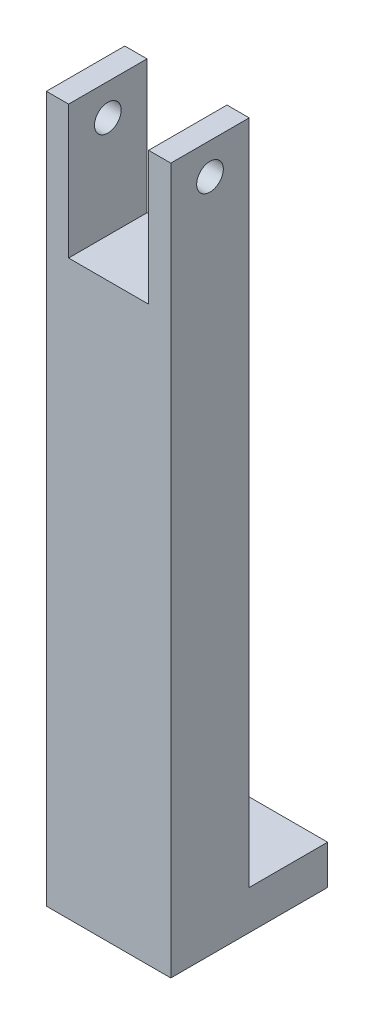
ISO-10303-21;
HEADER;
FILE_DESCRIPTION(('STEP AP214'),'2;1');
FILE_NAME('part.step','',(''),(''),'','','');
FILE_SCHEMA(('AUTOMOTIVE_DESIGN { 1 0 10303 214 1 1 1 1 }'));
ENDSEC;
DATA;
#1=APPLICATION_CONTEXT('core data for automotive mechanical design processes');
#2=APPLICATION_PROTOCOL_DEFINITION('international standard','automotive_design',2000,#1);
#3=PRODUCT_CONTEXT('',#1,'mechanical');
#4=PRODUCT('Part','Part','',(#3));
#5=PRODUCT_RELATED_PRODUCT_CATEGORY('part','',(#4));
#6=PRODUCT_DEFINITION_FORMATION('','',#4);
#7=PRODUCT_DEFINITION_CONTEXT('part definition',#1,'design');
#8=PRODUCT_DEFINITION('design','',#6,#7);
#9=PRODUCT_DEFINITION_SHAPE('','',#8);
#10=(LENGTH_UNIT() NAMED_UNIT(*) SI_UNIT(.MILLI.,.METRE.));
#11=(NAMED_UNIT(*) PLANE_ANGLE_UNIT() SI_UNIT($,.RADIAN.));
#12=(NAMED_UNIT(*) SI_UNIT($,.STERADIAN.) SOLID_ANGLE_UNIT());
#13=UNCERTAINTY_MEASURE_WITH_UNIT(LENGTH_MEASURE(1.E-05),#10,'distance_accuracy_value','');
#14=(GEOMETRIC_REPRESENTATION_CONTEXT(3) GLOBAL_UNCERTAINTY_ASSIGNED_CONTEXT((#13)) GLOBAL_UNIT_ASSIGNED_CONTEXT((#10,
#11,#12)) REPRESENTATION_CONTEXT('',''));
#15=CARTESIAN_POINT('',(0.,0.,0.));
#16=DIRECTION('',(0.,0.,1.));
#17=DIRECTION('',(1.,0.,0.));
#18=AXIS2_PLACEMENT_3D('',#15,#16,#17);
#19=CARTESIAN_POINT('',(15.8666666666667,85.,10.));
#20=DIRECTION('',(-1.,0.,0.));
#21=DIRECTION('',(0.,0.,1.));
#22=AXIS2_PLACEMENT_3D('',#19,#20,#21);
#23=PLANE('',#22);
#24=CARTESIAN_POINT('',(15.8666666666667,81.,5.));
#25=DIRECTION('',(1.,0.,0.));
#26=DIRECTION('',(0.,0.,-1.));
#27=AXIS2_PLACEMENT_3D('',#24,#25,#26);
#28=CIRCLE('',#27,1.69999999999999);
#29=CARTESIAN_POINT('',(15.8666666666667,81.,3.30000000000001));
#30=VERTEX_POINT('',#29);
#31=EDGE_CURVE('E154',#30,#30,#28,.T.);
#32=ORIENTED_EDGE('',*,*,#31,.F.);
#33=EDGE_LOOP('',(#32));
#34=FACE_BOUND('',#33,.T.);
#35=DIRECTION('',(0.,1.,0.));
#36=VECTOR('',#35,1.);
#37=CARTESIAN_POINT('',(15.8666666666667,85.,0.));
#38=LINE('',#37,#36);
#39=CARTESIAN_POINT('',(15.8666666666667,0.,0.));
#40=VERTEX_POINT('',#39);
#41=CARTESIAN_POINT('',(15.8666666666667,85.,0.));
#42=VERTEX_POINT('',#41);
#43=EDGE_CURVE('E134',#40,#42,#38,.T.);
#44=ORIENTED_EDGE('',*,*,#43,.T.);
#45=DIRECTION('',(0.,0.,-1.));
#46=VECTOR('',#45,1.);
#47=CARTESIAN_POINT('',(15.8666666666667,85.,10.));
#48=LINE('',#47,#46);
#49=CARTESIAN_POINT('',(15.8666666666667,85.,10.));
#50=VERTEX_POINT('',#49);
#51=EDGE_CURVE('E11',#50,#42,#48,.T.);
#52=ORIENTED_EDGE('',*,*,#51,.F.);
#53=DIRECTION('',(0.,1.,0.));
#54=VECTOR('',#53,1.);
#55=CARTESIAN_POINT('',(15.8666666666667,79.3333333333334,10.));
#56=LINE('',#55,#54);
#57=CARTESIAN_POINT('',(15.8666666666667,-5.,10.));
#58=VERTEX_POINT('',#57);
#59=EDGE_CURVE('E90',#58,#50,#56,.T.);
#60=ORIENTED_EDGE('',*,*,#59,.F.);
#61=DIRECTION('',(0.,0.,-1.));
#62=VECTOR('',#61,1.);
#63=CARTESIAN_POINT('',(15.8666666666667,-5.,26.6358381547523));
#64=LINE('',#63,#62);
#65=CARTESIAN_POINT('',(15.8666666666667,-5.,-10.));
#66=VERTEX_POINT('',#65);
#67=EDGE_CURVE('E189',#58,#66,#64,.T.);
#68=ORIENTED_EDGE('',*,*,#67,.T.);
#69=DIRECTION('',(0.,-1.,0.));
#70=VECTOR('',#69,1.);
#71=CARTESIAN_POINT('',(15.8666666666667,0.,-10.));
#72=LINE('',#71,#70);
#73=CARTESIAN_POINT('',(15.8666666666667,0.,-10.));
#74=VERTEX_POINT('',#73);
#75=EDGE_CURVE('E173',#74,#66,#72,.T.);
#76=ORIENTED_EDGE('',*,*,#75,.F.);
#77=DIRECTION('',(0.,0.,-1.));
#78=VECTOR('',#77,1.);
#79=CARTESIAN_POINT('',(15.8666666666667,0.,26.6358381547523));
#80=LINE('',#79,#78);
#81=EDGE_CURVE('E182',#40,#74,#80,.T.);
#82=ORIENTED_EDGE('',*,*,#81,.F.);
#83=EDGE_LOOP('',(#44,#52,#60,#68,#76,#82));
#84=FACE_BOUND('',#83,.T.);
#85=ADVANCED_FACE('F33',(#34,#84),#23,.F.);
#86=CARTESIAN_POINT('',(13.0333333333333,85.,10.));
#87=DIRECTION('',(0.,-1.,0.));
#88=DIRECTION('',(0.,0.,-1.));
#89=AXIS2_PLACEMENT_3D('',#86,#87,#88);
#90=PLANE('',#89);
#91=DIRECTION('',(-1.,0.,0.));
#92=VECTOR('',#91,1.);
#93=CARTESIAN_POINT('',(13.0333333333333,85.,0.));
#94=LINE('',#93,#92);
#95=CARTESIAN_POINT('',(13.0333333333333,85.,0.));
#96=VERTEX_POINT('',#95);
#97=EDGE_CURVE('E137',#42,#96,#94,.T.);
#98=ORIENTED_EDGE('',*,*,#97,.T.);
#99=DIRECTION('',(0.,0.,-1.));
#100=VECTOR('',#99,1.);
#101=CARTESIAN_POINT('',(13.0333333333333,85.,10.));
#102=LINE('',#101,#100);
#103=CARTESIAN_POINT('',(13.0333333333333,85.,10.));
#104=VERTEX_POINT('',#103);
#105=EDGE_CURVE('E42',#104,#96,#102,.T.);
#106=ORIENTED_EDGE('',*,*,#105,.F.);
#107=DIRECTION('',(-1.,0.,0.));
#108=VECTOR('',#107,1.);
#109=CARTESIAN_POINT('',(13.0333333333333,85.,10.));
#110=LINE('',#109,#108);
#111=EDGE_CURVE('E195',#50,#104,#110,.T.);
#112=ORIENTED_EDGE('',*,*,#111,.F.);
#113=ORIENTED_EDGE('',*,*,#51,.T.);
#114=EDGE_LOOP('',(#98,#106,#112,#113));
#115=FACE_BOUND('',#114,.T.);
#116=ADVANCED_FACE('F199',(#115),#90,.F.);
#117=CARTESIAN_POINT('',(13.0333333333333,68.,10.));
#118=DIRECTION('',(1.,0.,0.));
#119=DIRECTION('',(0.,0.,-1.));
#120=AXIS2_PLACEMENT_3D('',#117,#118,#119);
#121=PLANE('',#120);
#122=CARTESIAN_POINT('',(13.0333333333333,81.,5.));
#123=DIRECTION('',(1.,0.,0.));
#124=DIRECTION('',(0.,0.,-1.));
#125=AXIS2_PLACEMENT_3D('',#122,#123,#124);
#126=CIRCLE('',#125,1.69999999999999);
#127=CARTESIAN_POINT('',(13.0333333333333,81.,3.30000000000001));
#128=VERTEX_POINT('',#127);
#129=EDGE_CURVE('E158',#128,#128,#126,.T.);
#130=ORIENTED_EDGE('',*,*,#129,.T.);
#131=EDGE_LOOP('',(#130));
#132=FACE_BOUND('',#131,.T.);
#133=DIRECTION('',(0.,-1.,0.));
#134=VECTOR('',#133,1.);
#135=CARTESIAN_POINT('',(13.0333333333333,68.,0.));
#136=LINE('',#135,#134);
#137=CARTESIAN_POINT('',(13.0333333333333,68.,0.));
#138=VERTEX_POINT('',#137);
#139=EDGE_CURVE('E139',#96,#138,#136,.T.);
#140=ORIENTED_EDGE('',*,*,#139,.T.);
#141=DIRECTION('',(0.,0.,-1.));
#142=VECTOR('',#141,1.);
#143=CARTESIAN_POINT('',(13.0333333333333,68.,10.));
#144=LINE('',#143,#142);
#145=CARTESIAN_POINT('',(13.0333333333333,68.,10.));
#146=VERTEX_POINT('',#145);
#147=EDGE_CURVE('E119',#146,#138,#144,.T.);
#148=ORIENTED_EDGE('',*,*,#147,.F.);
#149=DIRECTION('',(0.,-1.,0.));
#150=VECTOR('',#149,1.);
#151=CARTESIAN_POINT('',(13.0333333333333,68.,10.));
#152=LINE('',#151,#150);
#153=EDGE_CURVE('E107',#104,#146,#152,.T.);
#154=ORIENTED_EDGE('',*,*,#153,.F.);
#155=ORIENTED_EDGE('',*,*,#105,.T.);
#156=EDGE_LOOP('',(#140,#148,#154,#155));
#157=FACE_BOUND('',#156,.T.);
#158=ADVANCED_FACE('F203',(#132,#157),#121,.F.);
#159=CARTESIAN_POINT('',(2.83333333333333,68.,10.));
#160=DIRECTION('',(0.,-1.,0.));
#161=DIRECTION('',(0.,0.,-1.));
#162=AXIS2_PLACEMENT_3D('',#159,#160,#161);
#163=PLANE('',#162);
#164=DIRECTION('',(-1.,0.,0.));
#165=VECTOR('',#164,1.);
#166=CARTESIAN_POINT('',(2.83333333333333,68.,0.));
#167=LINE('',#166,#165);
#168=CARTESIAN_POINT('',(2.83333333333333,68.,0.));
#169=VERTEX_POINT('',#168);
#170=EDGE_CURVE('E116',#138,#169,#167,.T.);
#171=ORIENTED_EDGE('',*,*,#170,.T.);
#172=DIRECTION('',(0.,0.,-1.));
#173=VECTOR('',#172,1.);
#174=CARTESIAN_POINT('',(2.83333333333333,68.,10.));
#175=LINE('',#174,#173);
#176=CARTESIAN_POINT('',(2.83333333333333,68.,10.));
#177=VERTEX_POINT('',#176);
#178=EDGE_CURVE('E113',#177,#169,#175,.T.);
#179=ORIENTED_EDGE('',*,*,#178,.F.);
#180=DIRECTION('',(-1.,0.,0.));
#181=VECTOR('',#180,1.);
#182=CARTESIAN_POINT('',(2.83333333333333,68.,10.));
#183=LINE('',#182,#181);
#184=EDGE_CURVE('E100',#146,#177,#183,.T.);
#185=ORIENTED_EDGE('',*,*,#184,.F.);
#186=ORIENTED_EDGE('',*,*,#147,.T.);
#187=EDGE_LOOP('',(#171,#179,#185,#186));
#188=FACE_BOUND('',#187,.T.);
#189=ADVANCED_FACE('F114',(#188),#163,.F.);
#190=CARTESIAN_POINT('',(2.83333333333333,85.,10.));
#191=DIRECTION('',(-1.,0.,0.));
#192=DIRECTION('',(0.,0.,1.));
#193=AXIS2_PLACEMENT_3D('',#190,#191,#192);
#194=PLANE('',#193);
#195=CARTESIAN_POINT('',(2.83333333333333,81.,5.));
#196=DIRECTION('',(-1.,0.,0.));
#197=DIRECTION('',(0.,0.,1.));
#198=AXIS2_PLACEMENT_3D('',#195,#196,#197);
#199=CIRCLE('',#198,1.69999999999999);
#200=CARTESIAN_POINT('',(2.83333333333333,81.,6.69999999999999));
#201=VERTEX_POINT('',#200);
#202=EDGE_CURVE('E153',#201,#201,#199,.T.);
#203=ORIENTED_EDGE('',*,*,#202,.T.);
#204=EDGE_LOOP('',(#203));
#205=FACE_BOUND('',#204,.T.);
#206=DIRECTION('',(0.,1.,0.));
#207=VECTOR('',#206,1.);
#208=CARTESIAN_POINT('',(2.83333333333333,85.,0.));
#209=LINE('',#208,#207);
#210=CARTESIAN_POINT('',(2.83333333333333,85.,0.));
#211=VERTEX_POINT('',#210);
#212=EDGE_CURVE('E142',#169,#211,#209,.T.);
#213=ORIENTED_EDGE('',*,*,#212,.T.);
#214=DIRECTION('',(0.,0.,-1.));
#215=VECTOR('',#214,1.);
#216=CARTESIAN_POINT('',(2.83333333333333,85.,10.));
#217=LINE('',#216,#215);
#218=CARTESIAN_POINT('',(2.83333333333333,85.,10.));
#219=VERTEX_POINT('',#218);
#220=EDGE_CURVE('E120',#219,#211,#217,.T.);
#221=ORIENTED_EDGE('',*,*,#220,.F.);
#222=DIRECTION('',(0.,1.,0.));
#223=VECTOR('',#222,1.);
#224=CARTESIAN_POINT('',(2.83333333333333,85.,10.));
#225=LINE('',#224,#223);
#226=EDGE_CURVE('E104',#177,#219,#225,.T.);
#227=ORIENTED_EDGE('',*,*,#226,.F.);
#228=ORIENTED_EDGE('',*,*,#178,.T.);
#229=EDGE_LOOP('',(#213,#221,#227,#228));
#230=FACE_BOUND('',#229,.T.);
#231=ADVANCED_FACE('F122',(#205,#230),#194,.F.);
#232=CARTESIAN_POINT('',(0.,85.,10.));
#233=DIRECTION('',(0.,-1.,0.));
#234=DIRECTION('',(0.,0.,-1.));
#235=AXIS2_PLACEMENT_3D('',#232,#233,#234);
#236=PLANE('',#235);
#237=DIRECTION('',(-1.,0.,0.));
#238=VECTOR('',#237,1.);
#239=CARTESIAN_POINT('',(0.,85.,0.));
#240=LINE('',#239,#238);
#241=CARTESIAN_POINT('',(0.,85.,0.));
#242=VERTEX_POINT('',#241);
#243=EDGE_CURVE('E144',#211,#242,#240,.T.);
#244=ORIENTED_EDGE('',*,*,#243,.T.);
#245=DIRECTION('',(0.,0.,-1.));
#246=VECTOR('',#245,1.);
#247=CARTESIAN_POINT('',(0.,85.,10.));
#248=LINE('',#247,#246);
#249=CARTESIAN_POINT('',(0.,85.,10.));
#250=VERTEX_POINT('',#249);
#251=EDGE_CURVE('E130',#250,#242,#248,.T.);
#252=ORIENTED_EDGE('',*,*,#251,.F.);
#253=DIRECTION('',(-1.,0.,0.));
#254=VECTOR('',#253,1.);
#255=CARTESIAN_POINT('',(0.,85.,10.));
#256=LINE('',#255,#254);
#257=EDGE_CURVE('E51',#219,#250,#256,.T.);
#258=ORIENTED_EDGE('',*,*,#257,.F.);
#259=ORIENTED_EDGE('',*,*,#220,.T.);
#260=EDGE_LOOP('',(#244,#252,#258,#259));
#261=FACE_BOUND('',#260,.T.);
#262=ADVANCED_FACE('F206',(#261),#236,.F.);
#263=CARTESIAN_POINT('',(0.,0.,10.));
#264=DIRECTION('',(1.,0.,0.));
#265=DIRECTION('',(0.,0.,-1.));
#266=AXIS2_PLACEMENT_3D('',#263,#264,#265);
#267=PLANE('',#266);
#268=CARTESIAN_POINT('',(0.,81.,5.));
#269=DIRECTION('',(1.,0.,0.));
#270=DIRECTION('',(0.,0.,-1.));
#271=AXIS2_PLACEMENT_3D('',#268,#269,#270);
#272=CIRCLE('',#271,1.69999999999999);
#273=CARTESIAN_POINT('',(0.,81.,3.30000000000001));
#274=VERTEX_POINT('',#273);
#275=EDGE_CURVE('E151',#274,#274,#272,.T.);
#276=ORIENTED_EDGE('',*,*,#275,.T.);
#277=EDGE_LOOP('',(#276));
#278=FACE_BOUND('',#277,.T.);
#279=DIRECTION('',(0.,-1.,0.));
#280=VECTOR('',#279,1.);
#281=CARTESIAN_POINT('',(0.,0.,0.));
#282=LINE('',#281,#280);
#283=CARTESIAN_POINT('',(0.,0.,0.));
#284=VERTEX_POINT('',#283);
#285=EDGE_CURVE('E78',#242,#284,#282,.T.);
#286=ORIENTED_EDGE('',*,*,#285,.T.);
#287=DIRECTION('',(0.,0.,-1.));
#288=VECTOR('',#287,1.);
#289=CARTESIAN_POINT('',(0.,0.,26.6358381547523));
#290=LINE('',#289,#288);
#291=CARTESIAN_POINT('',(0.,0.,-10.));
#292=VERTEX_POINT('',#291);
#293=EDGE_CURVE('E184',#284,#292,#290,.T.);
#294=ORIENTED_EDGE('',*,*,#293,.T.);
#295=DIRECTION('',(0.,1.,0.));
#296=VECTOR('',#295,1.);
#297=CARTESIAN_POINT('',(0.,-5.,-10.));
#298=LINE('',#297,#296);
#299=CARTESIAN_POINT('',(0.,-5.,-10.));
#300=VERTEX_POINT('',#299);
#301=EDGE_CURVE('E179',#300,#292,#298,.T.);
#302=ORIENTED_EDGE('',*,*,#301,.F.);
#303=DIRECTION('',(0.,0.,-1.));
#304=VECTOR('',#303,1.);
#305=CARTESIAN_POINT('',(0.,-5.,26.6358381547523));
#306=LINE('',#305,#304);
#307=CARTESIAN_POINT('',(0.,-5.,10.));
#308=VERTEX_POINT('',#307);
#309=EDGE_CURVE('E186',#308,#300,#306,.T.);
#310=ORIENTED_EDGE('',*,*,#309,.F.);
#311=DIRECTION('',(0.,-1.,0.));
#312=VECTOR('',#311,1.);
#313=CARTESIAN_POINT('',(0.,79.3333333333334,10.));
#314=LINE('',#313,#312);
#315=EDGE_CURVE('E125',#250,#308,#314,.T.);
#316=ORIENTED_EDGE('',*,*,#315,.F.);
#317=ORIENTED_EDGE('',*,*,#251,.T.);
#318=EDGE_LOOP('',(#286,#294,#302,#310,#316,#317));
#319=FACE_BOUND('',#318,.T.);
#320=ADVANCED_FACE('F209',(#278,#319),#267,.F.);
#321=CARTESIAN_POINT('',(0.,0.,10.));
#322=DIRECTION('',(0.,0.,-1.));
#323=DIRECTION('',(-1.,0.,0.));
#324=AXIS2_PLACEMENT_3D('',#321,#322,#323);
#325=PLANE('',#324);
#326=ORIENTED_EDGE('',*,*,#315,.T.);
#327=DIRECTION('',(1.,0.,0.));
#328=VECTOR('',#327,1.);
#329=CARTESIAN_POINT('',(15.8666666666667,-5.,10.));
#330=LINE('',#329,#328);
#331=EDGE_CURVE('E135',#308,#58,#330,.T.);
#332=ORIENTED_EDGE('',*,*,#331,.T.);
#333=ORIENTED_EDGE('',*,*,#59,.T.);
#334=ORIENTED_EDGE('',*,*,#111,.T.);
#335=ORIENTED_EDGE('',*,*,#153,.T.);
#336=ORIENTED_EDGE('',*,*,#184,.T.);
#337=ORIENTED_EDGE('',*,*,#226,.T.);
#338=ORIENTED_EDGE('',*,*,#257,.T.);
#339=EDGE_LOOP('',(#326,#332,#333,#334,#335,#336,#337,#338));
#340=FACE_BOUND('',#339,.T.);
#341=ADVANCED_FACE('F102',(#340),#325,.F.);
#342=CARTESIAN_POINT('',(0.,0.,0.));
#343=DIRECTION('',(0.,0.,-1.));
#344=DIRECTION('',(-1.,0.,0.));
#345=AXIS2_PLACEMENT_3D('',#342,#343,#344);
#346=PLANE('',#345);
#347=DIRECTION('',(1.,0.,0.));
#348=VECTOR('',#347,1.);
#349=CARTESIAN_POINT('',(0.,0.,0.));
#350=LINE('',#349,#348);
#351=EDGE_CURVE('E131',#284,#40,#350,.T.);
#352=ORIENTED_EDGE('',*,*,#351,.F.);
#353=ORIENTED_EDGE('',*,*,#285,.F.);
#354=ORIENTED_EDGE('',*,*,#243,.F.);
#355=ORIENTED_EDGE('',*,*,#212,.F.);
#356=ORIENTED_EDGE('',*,*,#170,.F.);
#357=ORIENTED_EDGE('',*,*,#139,.F.);
#358=ORIENTED_EDGE('',*,*,#97,.F.);
#359=ORIENTED_EDGE('',*,*,#43,.F.);
#360=EDGE_LOOP('',(#352,#353,#354,#355,#356,#357,#358,#359));
#361=FACE_BOUND('',#360,.T.);
#362=ADVANCED_FACE('F204',(#361),#346,.T.);
#363=CARTESIAN_POINT('',(0.,0.,26.6358381547523));
#364=DIRECTION('',(0.,1.,0.));
#365=DIRECTION('',(0.,0.,1.));
#366=AXIS2_PLACEMENT_3D('',#363,#364,#365);
#367=PLANE('',#366);
#368=CARTESIAN_POINT('',(7.93333333333333,0.,-5.));
#369=DIRECTION('',(0.,1.,0.));
#370=DIRECTION('',(0.,0.,1.));
#371=AXIS2_PLACEMENT_3D('',#368,#369,#370);
#372=CIRCLE('',#371,1.7);
#373=CARTESIAN_POINT('',(7.93333333333333,0.,-3.3));
#374=VERTEX_POINT('',#373);
#375=EDGE_CURVE('E165',#374,#374,#372,.T.);
#376=ORIENTED_EDGE('',*,*,#375,.F.);
#377=EDGE_LOOP('',(#376));
#378=FACE_BOUND('',#377,.T.);
#379=ORIENTED_EDGE('',*,*,#293,.F.);
#380=ORIENTED_EDGE('',*,*,#351,.T.);
#381=ORIENTED_EDGE('',*,*,#81,.T.);
#382=DIRECTION('',(1.,0.,0.));
#383=VECTOR('',#382,1.);
#384=CARTESIAN_POINT('',(0.,0.,-10.));
#385=LINE('',#384,#383);
#386=EDGE_CURVE('E170',#292,#74,#385,.T.);
#387=ORIENTED_EDGE('',*,*,#386,.F.);
#388=EDGE_LOOP('',(#379,#380,#381,#387));
#389=FACE_BOUND('',#388,.T.);
#390=ADVANCED_FACE('F233',(#378,#389),#367,.T.);
#391=CARTESIAN_POINT('',(15.8666666666667,-5.,26.6358381547523));
#392=DIRECTION('',(0.,-1.,0.));
#393=DIRECTION('',(0.,0.,-1.));
#394=AXIS2_PLACEMENT_3D('',#391,#392,#393);
#395=PLANE('',#394);
#396=CARTESIAN_POINT('',(7.93333333333333,-5.,-5.));
#397=DIRECTION('',(0.,-1.,0.));
#398=DIRECTION('',(0.,0.,-1.));
#399=AXIS2_PLACEMENT_3D('',#396,#397,#398);
#400=CIRCLE('',#399,1.7);
#401=CARTESIAN_POINT('',(7.93333333333333,-5.,-6.7));
#402=VERTEX_POINT('',#401);
#403=EDGE_CURVE('E36',#402,#402,#400,.T.);
#404=ORIENTED_EDGE('',*,*,#403,.F.);
#405=EDGE_LOOP('',(#404));
#406=FACE_BOUND('',#405,.T.);
#407=ORIENTED_EDGE('',*,*,#331,.F.);
#408=ORIENTED_EDGE('',*,*,#309,.T.);
#409=DIRECTION('',(-1.,0.,0.));
#410=VECTOR('',#409,1.);
#411=CARTESIAN_POINT('',(15.8666666666667,-5.,-10.));
#412=LINE('',#411,#410);
#413=EDGE_CURVE('E176',#66,#300,#412,.T.);
#414=ORIENTED_EDGE('',*,*,#413,.F.);
#415=ORIENTED_EDGE('',*,*,#67,.F.);
#416=EDGE_LOOP('',(#407,#408,#414,#415));
#417=FACE_BOUND('',#416,.T.);
#418=ADVANCED_FACE('F216',(#406,#417),#395,.T.);
#419=CARTESIAN_POINT('',(0.,0.,-10.));
#420=DIRECTION('',(0.,0.,-1.));
#421=DIRECTION('',(-1.,0.,0.));
#422=AXIS2_PLACEMENT_3D('',#419,#420,#421);
#423=PLANE('',#422);
#424=ORIENTED_EDGE('',*,*,#386,.T.);
#425=ORIENTED_EDGE('',*,*,#75,.T.);
#426=ORIENTED_EDGE('',*,*,#413,.T.);
#427=ORIENTED_EDGE('',*,*,#301,.T.);
#428=EDGE_LOOP('',(#424,#425,#426,#427));
#429=FACE_BOUND('',#428,.T.);
#430=ADVANCED_FACE('F228',(#429),#423,.T.);
#431=CARTESIAN_POINT('',(-20.1333333333333,81.,5.));
#432=DIRECTION('',(1.,0.,0.));
#433=DIRECTION('',(0.,0.,-1.));
#434=AXIS2_PLACEMENT_3D('',#431,#432,#433);
#435=CYLINDRICAL_SURFACE('',#434,1.69999999999999);
#436=ORIENTED_EDGE('',*,*,#275,.F.);
#437=EDGE_LOOP('',(#436));
#438=FACE_BOUND('',#437,.T.);
#439=ORIENTED_EDGE('',*,*,#202,.F.);
#440=EDGE_LOOP('',(#439));
#441=FACE_BOUND('',#440,.T.);
#442=ADVANCED_FACE('F288',(#438,#441),#435,.F.);
#443=ORIENTED_EDGE('',*,*,#31,.T.);
#444=EDGE_LOOP('',(#443));
#445=FACE_BOUND('',#444,.T.);
#446=ORIENTED_EDGE('',*,*,#129,.F.);
#447=EDGE_LOOP('',(#446));
#448=FACE_BOUND('',#447,.T.);
#449=ADVANCED_FACE('F323',(#445,#448),#435,.F.);
#450=CARTESIAN_POINT('',(7.93333333333333,-36.,-5.));
#451=DIRECTION('',(0.,1.,0.));
#452=DIRECTION('',(0.,0.,1.));
#453=AXIS2_PLACEMENT_3D('',#450,#451,#452);
#454=CYLINDRICAL_SURFACE('',#453,1.7);
#455=ORIENTED_EDGE('',*,*,#403,.T.);
#456=EDGE_LOOP('',(#455));
#457=FACE_BOUND('',#456,.T.);
#458=ORIENTED_EDGE('',*,*,#375,.T.);
#459=EDGE_LOOP('',(#458));
#460=FACE_BOUND('',#459,.T.);
#461=ADVANCED_FACE('F332',(#457,#460),#454,.F.);
#462=CLOSED_SHELL('',(#85,#116,#158,#189,#231,#262,#320,#341,#362,#390,#418,#430,#442,#449,#461));
#463=MANIFOLD_SOLID_BREP('B2',#462);
#464=ADVANCED_BREP_SHAPE_REPRESENTATION('',(#18,#463),#14);
#465=SHAPE_DEFINITION_REPRESENTATION(#9,#464);
ENDSEC;
END-ISO-10303-21;
